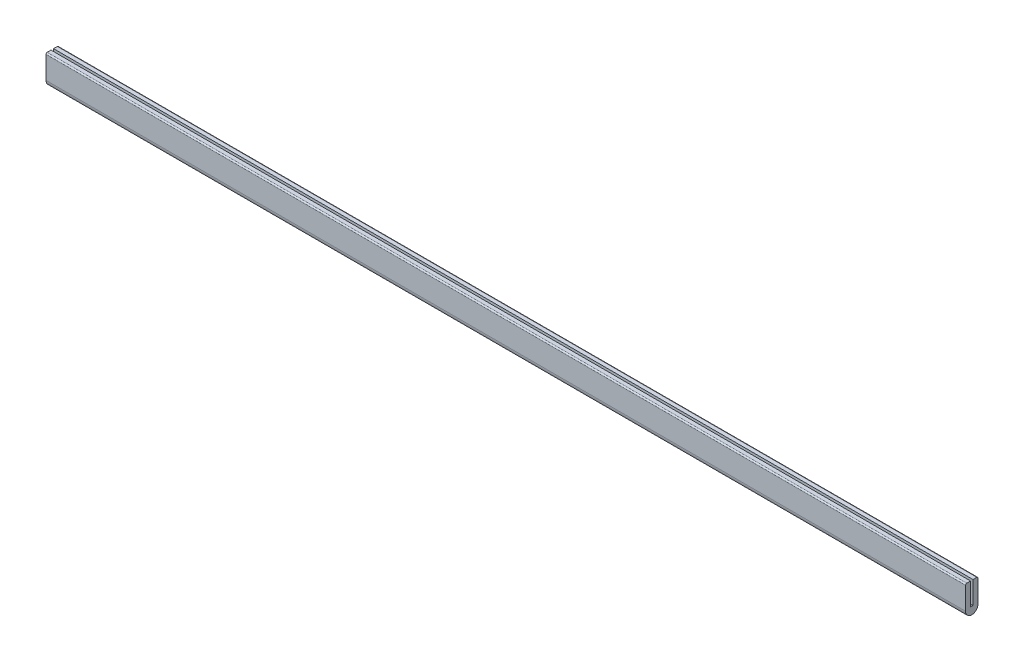
ISO-10303-21;
HEADER;
FILE_DESCRIPTION(('STEP AP214'),'2;1');
FILE_NAME('part.step','',(''),(''),'','','');
FILE_SCHEMA(('AUTOMOTIVE_DESIGN { 1 0 10303 214 1 1 1 1 }'));
ENDSEC;
DATA;
#1=APPLICATION_CONTEXT('core data for automotive mechanical design processes');
#2=APPLICATION_PROTOCOL_DEFINITION('international standard','automotive_design',2000,#1);
#3=PRODUCT_CONTEXT('',#1,'mechanical');
#4=PRODUCT('Part','Part','',(#3));
#5=PRODUCT_RELATED_PRODUCT_CATEGORY('part','',(#4));
#6=PRODUCT_DEFINITION_FORMATION('','',#4);
#7=PRODUCT_DEFINITION_CONTEXT('part definition',#1,'design');
#8=PRODUCT_DEFINITION('design','',#6,#7);
#9=PRODUCT_DEFINITION_SHAPE('','',#8);
#10=(LENGTH_UNIT() NAMED_UNIT(*) SI_UNIT(.MILLI.,.METRE.));
#11=(NAMED_UNIT(*) PLANE_ANGLE_UNIT() SI_UNIT($,.RADIAN.));
#12=(NAMED_UNIT(*) SI_UNIT($,.STERADIAN.) SOLID_ANGLE_UNIT());
#13=UNCERTAINTY_MEASURE_WITH_UNIT(LENGTH_MEASURE(1.E-05),#10,'distance_accuracy_value','');
#14=(GEOMETRIC_REPRESENTATION_CONTEXT(3) GLOBAL_UNCERTAINTY_ASSIGNED_CONTEXT((#13)) GLOBAL_UNIT_ASSIGNED_CONTEXT((#10,
#11,#12)) REPRESENTATION_CONTEXT('',''));
#15=CARTESIAN_POINT('',(0.,0.,0.));
#16=DIRECTION('',(0.,0.,1.));
#17=DIRECTION('',(1.,0.,0.));
#18=AXIS2_PLACEMENT_3D('',#15,#16,#17);
#19=CARTESIAN_POINT('',(584.2,28.575,1.5875));
#20=DIRECTION('',(0.,0.,1.));
#21=DIRECTION('',(0.,-1.,0.));
#22=AXIS2_PLACEMENT_3D('',#19,#20,#21);
#23=PLANE('',#22);
#24=DIRECTION('',(0.,1.,0.));
#25=VECTOR('',#24,1.);
#26=CARTESIAN_POINT('',(-584.2,28.575,1.5875));
#27=LINE('',#26,#25);
#28=CARTESIAN_POINT('',(-584.2,0.,1.5875));
#29=VERTEX_POINT('',#28);
#30=CARTESIAN_POINT('',(-584.2,28.575,1.5875));
#31=VERTEX_POINT('',#30);
#32=EDGE_CURVE('E135',#29,#31,#27,.T.);
#33=ORIENTED_EDGE('',*,*,#32,.T.);
#34=DIRECTION('',(-1.,0.,0.));
#35=VECTOR('',#34,1.);
#36=CARTESIAN_POINT('',(584.2,28.575,1.5875));
#37=LINE('',#36,#35);
#38=CARTESIAN_POINT('',(584.2,28.575,1.5875));
#39=VERTEX_POINT('',#38);
#40=EDGE_CURVE('E117',#39,#31,#37,.T.);
#41=ORIENTED_EDGE('',*,*,#40,.F.);
#42=DIRECTION('',(0.,1.,0.));
#43=VECTOR('',#42,1.);
#44=CARTESIAN_POINT('',(584.2,28.575,1.5875));
#45=LINE('',#44,#43);
#46=CARTESIAN_POINT('',(584.2,0.,1.5875));
#47=VERTEX_POINT('',#46);
#48=EDGE_CURVE('E123',#47,#39,#45,.T.);
#49=ORIENTED_EDGE('',*,*,#48,.F.);
#50=DIRECTION('',(-1.,0.,0.));
#51=VECTOR('',#50,1.);
#52=CARTESIAN_POINT('',(584.2,0.,1.5875));
#53=LINE('',#52,#51);
#54=EDGE_CURVE('E178',#47,#29,#53,.T.);
#55=ORIENTED_EDGE('',*,*,#54,.T.);
#56=EDGE_LOOP('',(#33,#41,#49,#55));
#57=FACE_BOUND('',#56,.T.);
#58=ADVANCED_FACE('F35',(#57),#23,.F.);
#59=CARTESIAN_POINT('',(584.2,28.575,1.5875));
#60=DIRECTION('',(0.,-1.,0.));
#61=DIRECTION('',(0.,0.,-1.));
#62=AXIS2_PLACEMENT_3D('',#59,#60,#61);
#63=PLANE('',#62);
#64=DIRECTION('',(0.,0.,1.));
#65=VECTOR('',#64,1.);
#66=CARTESIAN_POINT('',(-584.2,28.575,1.5875));
#67=LINE('',#66,#65);
#68=CARTESIAN_POINT('',(-584.2,28.575,6.34999999999999));
#69=VERTEX_POINT('',#68);
#70=EDGE_CURVE('E192',#31,#69,#67,.T.);
#71=ORIENTED_EDGE('',*,*,#70,.T.);
#72=DIRECTION('',(-1.,0.,0.));
#73=VECTOR('',#72,1.);
#74=CARTESIAN_POINT('',(584.2,28.575,6.34999999999999));
#75=LINE('',#74,#73);
#76=CARTESIAN_POINT('',(584.2,28.575,6.34999999999999));
#77=VERTEX_POINT('',#76);
#78=EDGE_CURVE('E120',#69,#77,#75,.F.);
#79=ORIENTED_EDGE('',*,*,#78,.T.);
#80=DIRECTION('',(0.,0.,1.));
#81=VECTOR('',#80,1.);
#82=CARTESIAN_POINT('',(584.2,28.575,1.5875));
#83=LINE('',#82,#81);
#84=EDGE_CURVE('E112',#39,#77,#83,.T.);
#85=ORIENTED_EDGE('',*,*,#84,.F.);
#86=ORIENTED_EDGE('',*,*,#40,.T.);
#87=EDGE_LOOP('',(#71,#79,#85,#86));
#88=FACE_BOUND('',#87,.T.);
#89=ADVANCED_FACE('F115',(#88),#63,.F.);
#90=CARTESIAN_POINT('',(584.2,28.575,7.93749999999999));
#91=DIRECTION('',(0.,0.,-1.));
#92=DIRECTION('',(0.,1.,0.));
#93=AXIS2_PLACEMENT_3D('',#90,#91,#92);
#94=PLANE('',#93);
#95=DIRECTION('',(0.,-1.,0.));
#96=VECTOR('',#95,1.);
#97=CARTESIAN_POINT('',(584.2,28.575,7.93749999999999));
#98=LINE('',#97,#96);
#99=CARTESIAN_POINT('',(584.2,26.9875,7.93749999999999));
#100=VERTEX_POINT('',#99);
#101=CARTESIAN_POINT('',(584.2,-1.58750000000001,7.9375));
#102=VERTEX_POINT('',#101);
#103=EDGE_CURVE('E122',#100,#102,#98,.T.);
#104=ORIENTED_EDGE('',*,*,#103,.F.);
#105=DIRECTION('',(-1.,0.,0.));
#106=VECTOR('',#105,1.);
#107=CARTESIAN_POINT('',(584.2,26.9875,7.93749999999999));
#108=LINE('',#107,#106);
#109=CARTESIAN_POINT('',(-584.2,26.9875,7.93749999999999));
#110=VERTEX_POINT('',#109);
#111=EDGE_CURVE('E136',#100,#110,#108,.T.);
#112=ORIENTED_EDGE('',*,*,#111,.T.);
#113=DIRECTION('',(0.,-1.,0.));
#114=VECTOR('',#113,1.);
#115=CARTESIAN_POINT('',(-584.2,28.575,7.93749999999999));
#116=LINE('',#115,#114);
#117=CARTESIAN_POINT('',(-584.2,-1.58750000000001,7.9375));
#118=VERTEX_POINT('',#117);
#119=EDGE_CURVE('E191',#110,#118,#116,.T.);
#120=ORIENTED_EDGE('',*,*,#119,.T.);
#121=DIRECTION('',(-1.,0.,0.));
#122=VECTOR('',#121,1.);
#123=CARTESIAN_POINT('',(584.2,-1.58750000000001,7.9375));
#124=LINE('',#123,#122);
#125=EDGE_CURVE('E137',#102,#118,#124,.T.);
#126=ORIENTED_EDGE('',*,*,#125,.F.);
#127=EDGE_LOOP('',(#104,#112,#120,#126));
#128=FACE_BOUND('',#127,.T.);
#129=ADVANCED_FACE('F208',(#128),#94,.F.);
#130=CARTESIAN_POINT('',(584.2,-1.58750000000001,0.));
#131=DIRECTION('',(-1.,0.,0.));
#132=DIRECTION('',(0.,0.,1.));
#133=AXIS2_PLACEMENT_3D('',#130,#131,#132);
#134=CYLINDRICAL_SURFACE('',#133,7.9375);
#135=CARTESIAN_POINT('',(-584.2,-1.58750000000001,0.));
#136=DIRECTION('',(1.,0.,0.));
#137=DIRECTION('',(0.,0.,1.));
#138=AXIS2_PLACEMENT_3D('',#135,#136,#137);
#139=CIRCLE('',#138,7.9375);
#140=CARTESIAN_POINT('',(-584.2,-1.5875,-7.9375));
#141=VERTEX_POINT('',#140);
#142=EDGE_CURVE('E173',#118,#141,#139,.T.);
#143=ORIENTED_EDGE('',*,*,#142,.T.);
#144=DIRECTION('',(-1.,0.,0.));
#145=VECTOR('',#144,1.);
#146=CARTESIAN_POINT('',(584.2,-1.5875,-7.9375));
#147=LINE('',#146,#145);
#148=CARTESIAN_POINT('',(584.2,-1.5875,-7.9375));
#149=VERTEX_POINT('',#148);
#150=EDGE_CURVE('E143',#149,#141,#147,.T.);
#151=ORIENTED_EDGE('',*,*,#150,.F.);
#152=CARTESIAN_POINT('',(584.2,-1.58750000000001,0.));
#153=DIRECTION('',(1.,0.,0.));
#154=DIRECTION('',(0.,0.,1.));
#155=AXIS2_PLACEMENT_3D('',#152,#153,#154);
#156=CIRCLE('',#155,7.9375);
#157=EDGE_CURVE('E202',#102,#149,#156,.T.);
#158=ORIENTED_EDGE('',*,*,#157,.F.);
#159=ORIENTED_EDGE('',*,*,#125,.T.);
#160=EDGE_LOOP('',(#143,#151,#158,#159));
#161=FACE_BOUND('',#160,.T.);
#162=ADVANCED_FACE('F209',(#161),#134,.T.);
#163=CARTESIAN_POINT('',(584.2,28.575,-7.93749999999999));
#164=DIRECTION('',(0.,0.,1.));
#165=DIRECTION('',(0.,-1.,0.));
#166=AXIS2_PLACEMENT_3D('',#163,#164,#165);
#167=PLANE('',#166);
#168=DIRECTION('',(0.,1.,0.));
#169=VECTOR('',#168,1.);
#170=CARTESIAN_POINT('',(-584.2,28.575,-7.93749999999999));
#171=LINE('',#170,#169);
#172=CARTESIAN_POINT('',(-584.2,26.9875,-7.93749999999999));
#173=VERTEX_POINT('',#172);
#174=EDGE_CURVE('E170',#141,#173,#171,.T.);
#175=ORIENTED_EDGE('',*,*,#174,.T.);
#176=DIRECTION('',(-1.,0.,0.));
#177=VECTOR('',#176,1.);
#178=CARTESIAN_POINT('',(584.2,26.9875,-7.93749999999999));
#179=LINE('',#178,#177);
#180=CARTESIAN_POINT('',(584.2,26.9875,-7.93749999999999));
#181=VERTEX_POINT('',#180);
#182=EDGE_CURVE('E11',#173,#181,#179,.F.);
#183=ORIENTED_EDGE('',*,*,#182,.T.);
#184=DIRECTION('',(0.,1.,0.));
#185=VECTOR('',#184,1.);
#186=CARTESIAN_POINT('',(584.2,28.575,-7.93749999999999));
#187=LINE('',#186,#185);
#188=EDGE_CURVE('E187',#149,#181,#187,.T.);
#189=ORIENTED_EDGE('',*,*,#188,.F.);
#190=ORIENTED_EDGE('',*,*,#150,.T.);
#191=EDGE_LOOP('',(#175,#183,#189,#190));
#192=FACE_BOUND('',#191,.T.);
#193=ADVANCED_FACE('F186',(#192),#167,.F.);
#194=CARTESIAN_POINT('',(584.2,28.575,-7.93749999999999));
#195=DIRECTION('',(0.,-1.,0.));
#196=DIRECTION('',(0.,0.,-1.));
#197=AXIS2_PLACEMENT_3D('',#194,#195,#196);
#198=PLANE('',#197);
#199=DIRECTION('',(0.,0.,1.));
#200=VECTOR('',#199,1.);
#201=CARTESIAN_POINT('',(584.2,28.575,-7.93749999999999));
#202=LINE('',#201,#200);
#203=CARTESIAN_POINT('',(584.2,28.575,-6.34999999999999));
#204=VERTEX_POINT('',#203);
#205=CARTESIAN_POINT('',(584.2,28.575,-1.58749999999999));
#206=VERTEX_POINT('',#205);
#207=EDGE_CURVE('E161',#204,#206,#202,.T.);
#208=ORIENTED_EDGE('',*,*,#207,.F.);
#209=DIRECTION('',(-1.,0.,0.));
#210=VECTOR('',#209,1.);
#211=CARTESIAN_POINT('',(584.2,28.575,-6.34999999999999));
#212=LINE('',#211,#210);
#213=CARTESIAN_POINT('',(-584.2,28.575,-6.34999999999999));
#214=VERTEX_POINT('',#213);
#215=EDGE_CURVE('E43',#204,#214,#212,.T.);
#216=ORIENTED_EDGE('',*,*,#215,.T.);
#217=DIRECTION('',(0.,0.,1.));
#218=VECTOR('',#217,1.);
#219=CARTESIAN_POINT('',(-584.2,28.575,-7.93749999999999));
#220=LINE('',#219,#218);
#221=CARTESIAN_POINT('',(-584.2,28.575,-1.58749999999999));
#222=VERTEX_POINT('',#221);
#223=EDGE_CURVE('E159',#214,#222,#220,.T.);
#224=ORIENTED_EDGE('',*,*,#223,.T.);
#225=DIRECTION('',(-1.,0.,0.));
#226=VECTOR('',#225,1.);
#227=CARTESIAN_POINT('',(584.2,28.575,-1.58749999999999));
#228=LINE('',#227,#226);
#229=EDGE_CURVE('E183',#206,#222,#228,.T.);
#230=ORIENTED_EDGE('',*,*,#229,.F.);
#231=EDGE_LOOP('',(#208,#216,#224,#230));
#232=FACE_BOUND('',#231,.T.);
#233=ADVANCED_FACE('F157',(#232),#198,.F.);
#234=CARTESIAN_POINT('',(584.2,28.575,-1.58749999999999));
#235=DIRECTION('',(0.,0.,-1.));
#236=DIRECTION('',(0.,1.,0.));
#237=AXIS2_PLACEMENT_3D('',#234,#235,#236);
#238=PLANE('',#237);
#239=DIRECTION('',(0.,-1.,0.));
#240=VECTOR('',#239,1.);
#241=CARTESIAN_POINT('',(-584.2,28.575,-1.58749999999999));
#242=LINE('',#241,#240);
#243=CARTESIAN_POINT('',(-584.2,0.,-1.5875));
#244=VERTEX_POINT('',#243);
#245=EDGE_CURVE('E169',#222,#244,#242,.T.);
#246=ORIENTED_EDGE('',*,*,#245,.T.);
#247=DIRECTION('',(-1.,0.,0.));
#248=VECTOR('',#247,1.);
#249=CARTESIAN_POINT('',(584.2,0.,-1.5875));
#250=LINE('',#249,#248);
#251=CARTESIAN_POINT('',(584.2,0.,-1.5875));
#252=VERTEX_POINT('',#251);
#253=EDGE_CURVE('E180',#252,#244,#250,.T.);
#254=ORIENTED_EDGE('',*,*,#253,.F.);
#255=DIRECTION('',(0.,-1.,0.));
#256=VECTOR('',#255,1.);
#257=CARTESIAN_POINT('',(584.2,28.575,-1.58749999999999));
#258=LINE('',#257,#256);
#259=EDGE_CURVE('E198',#206,#252,#258,.T.);
#260=ORIENTED_EDGE('',*,*,#259,.F.);
#261=ORIENTED_EDGE('',*,*,#229,.T.);
#262=EDGE_LOOP('',(#246,#254,#260,#261));
#263=FACE_BOUND('',#262,.T.);
#264=ADVANCED_FACE('F237',(#263),#238,.F.);
#265=CARTESIAN_POINT('',(584.2,0.,1.5875));
#266=DIRECTION('',(0.,-1.,0.));
#267=DIRECTION('',(0.,0.,-1.));
#268=AXIS2_PLACEMENT_3D('',#265,#266,#267);
#269=PLANE('',#268);
#270=DIRECTION('',(0.,0.,1.));
#271=VECTOR('',#270,1.);
#272=CARTESIAN_POINT('',(-584.2,0.,1.5875));
#273=LINE('',#272,#271);
#274=EDGE_CURVE('E132',#244,#29,#273,.T.);
#275=ORIENTED_EDGE('',*,*,#274,.T.);
#276=ORIENTED_EDGE('',*,*,#54,.F.);
#277=DIRECTION('',(0.,0.,1.));
#278=VECTOR('',#277,1.);
#279=CARTESIAN_POINT('',(584.2,0.,1.5875));
#280=LINE('',#279,#278);
#281=EDGE_CURVE('E128',#252,#47,#280,.T.);
#282=ORIENTED_EDGE('',*,*,#281,.F.);
#283=ORIENTED_EDGE('',*,*,#253,.T.);
#284=EDGE_LOOP('',(#275,#276,#282,#283));
#285=FACE_BOUND('',#284,.T.);
#286=ADVANCED_FACE('F233',(#285),#269,.F.);
#287=CARTESIAN_POINT('',(584.2,-1.58750000000001,0.));
#288=DIRECTION('',(-1.,0.,0.));
#289=DIRECTION('',(0.,0.,1.));
#290=AXIS2_PLACEMENT_3D('',#287,#288,#289);
#291=PLANE('',#290);
#292=ORIENTED_EDGE('',*,*,#84,.T.);
#293=CARTESIAN_POINT('',(584.2,26.9875,6.34999999999999));
#294=DIRECTION('',(-1.,0.,0.));
#295=DIRECTION('',(0.,0.,1.));
#296=AXIS2_PLACEMENT_3D('',#293,#294,#295);
#297=CIRCLE('',#296,1.5875);
#298=EDGE_CURVE('E152',#77,#100,#297,.F.);
#299=ORIENTED_EDGE('',*,*,#298,.T.);
#300=ORIENTED_EDGE('',*,*,#103,.T.);
#301=ORIENTED_EDGE('',*,*,#157,.T.);
#302=ORIENTED_EDGE('',*,*,#188,.T.);
#303=CARTESIAN_POINT('',(584.2,26.9875,-6.34999999999999));
#304=DIRECTION('',(-1.,0.,0.));
#305=DIRECTION('',(0.,0.,1.));
#306=AXIS2_PLACEMENT_3D('',#303,#304,#305);
#307=CIRCLE('',#306,1.5875);
#308=EDGE_CURVE('E50',#181,#204,#307,.F.);
#309=ORIENTED_EDGE('',*,*,#308,.T.);
#310=ORIENTED_EDGE('',*,*,#207,.T.);
#311=ORIENTED_EDGE('',*,*,#259,.T.);
#312=ORIENTED_EDGE('',*,*,#281,.T.);
#313=ORIENTED_EDGE('',*,*,#48,.T.);
#314=EDGE_LOOP('',(#292,#299,#300,#301,#302,#309,#310,#311,#312,#313));
#315=FACE_BOUND('',#314,.T.);
#316=ADVANCED_FACE('F126',(#315),#291,.F.);
#317=CARTESIAN_POINT('',(-584.2,-1.58750000000001,0.));
#318=DIRECTION('',(-1.,0.,0.));
#319=DIRECTION('',(0.,0.,1.));
#320=AXIS2_PLACEMENT_3D('',#317,#318,#319);
#321=PLANE('',#320);
#322=ORIENTED_EDGE('',*,*,#119,.F.);
#323=CARTESIAN_POINT('',(-584.2,26.9875,6.34999999999999));
#324=DIRECTION('',(-1.,0.,0.));
#325=DIRECTION('',(0.,0.,1.));
#326=AXIS2_PLACEMENT_3D('',#323,#324,#325);
#327=CIRCLE('',#326,1.5875);
#328=EDGE_CURVE('E148',#110,#69,#327,.T.);
#329=ORIENTED_EDGE('',*,*,#328,.T.);
#330=ORIENTED_EDGE('',*,*,#70,.F.);
#331=ORIENTED_EDGE('',*,*,#32,.F.);
#332=ORIENTED_EDGE('',*,*,#274,.F.);
#333=ORIENTED_EDGE('',*,*,#245,.F.);
#334=ORIENTED_EDGE('',*,*,#223,.F.);
#335=CARTESIAN_POINT('',(-584.2,26.9875,-6.34999999999999));
#336=DIRECTION('',(-1.,0.,0.));
#337=DIRECTION('',(0.,0.,1.));
#338=AXIS2_PLACEMENT_3D('',#335,#336,#337);
#339=CIRCLE('',#338,1.5875);
#340=EDGE_CURVE('E140',#214,#173,#339,.T.);
#341=ORIENTED_EDGE('',*,*,#340,.T.);
#342=ORIENTED_EDGE('',*,*,#174,.F.);
#343=ORIENTED_EDGE('',*,*,#142,.F.);
#344=EDGE_LOOP('',(#322,#329,#330,#331,#332,#333,#334,#341,#342,#343));
#345=FACE_BOUND('',#344,.T.);
#346=ADVANCED_FACE('F166',(#345),#321,.T.);
#347=CARTESIAN_POINT('',(584.2,26.9875,6.34999999999999));
#348=DIRECTION('',(-1.,0.,0.));
#349=DIRECTION('',(0.,0.,1.));
#350=AXIS2_PLACEMENT_3D('',#347,#348,#349);
#351=CYLINDRICAL_SURFACE('',#350,1.5875);
#352=ORIENTED_EDGE('',*,*,#298,.F.);
#353=ORIENTED_EDGE('',*,*,#78,.F.);
#354=ORIENTED_EDGE('',*,*,#328,.F.);
#355=ORIENTED_EDGE('',*,*,#111,.F.);
#356=EDGE_LOOP('',(#352,#353,#354,#355));
#357=FACE_BOUND('',#356,.T.);
#358=ADVANCED_FACE('F224',(#357),#351,.T.);
#359=CARTESIAN_POINT('',(584.2,26.9875,-6.34999999999999));
#360=DIRECTION('',(-1.,0.,0.));
#361=DIRECTION('',(0.,0.,1.));
#362=AXIS2_PLACEMENT_3D('',#359,#360,#361);
#363=CYLINDRICAL_SURFACE('',#362,1.5875);
#364=ORIENTED_EDGE('',*,*,#308,.F.);
#365=ORIENTED_EDGE('',*,*,#182,.F.);
#366=ORIENTED_EDGE('',*,*,#340,.F.);
#367=ORIENTED_EDGE('',*,*,#215,.F.);
#368=EDGE_LOOP('',(#364,#365,#366,#367));
#369=FACE_BOUND('',#368,.T.);
#370=ADVANCED_FACE('F37',(#369),#363,.T.);
#371=CLOSED_SHELL('',(#58,#89,#129,#162,#193,#233,#264,#286,#316,#346,#358,#370));
#372=MANIFOLD_SOLID_BREP('B2',#371);
#373=ADVANCED_BREP_SHAPE_REPRESENTATION('',(#18,#372),#14);
#374=SHAPE_DEFINITION_REPRESENTATION(#9,#373);
ENDSEC;
END-ISO-10303-21;
